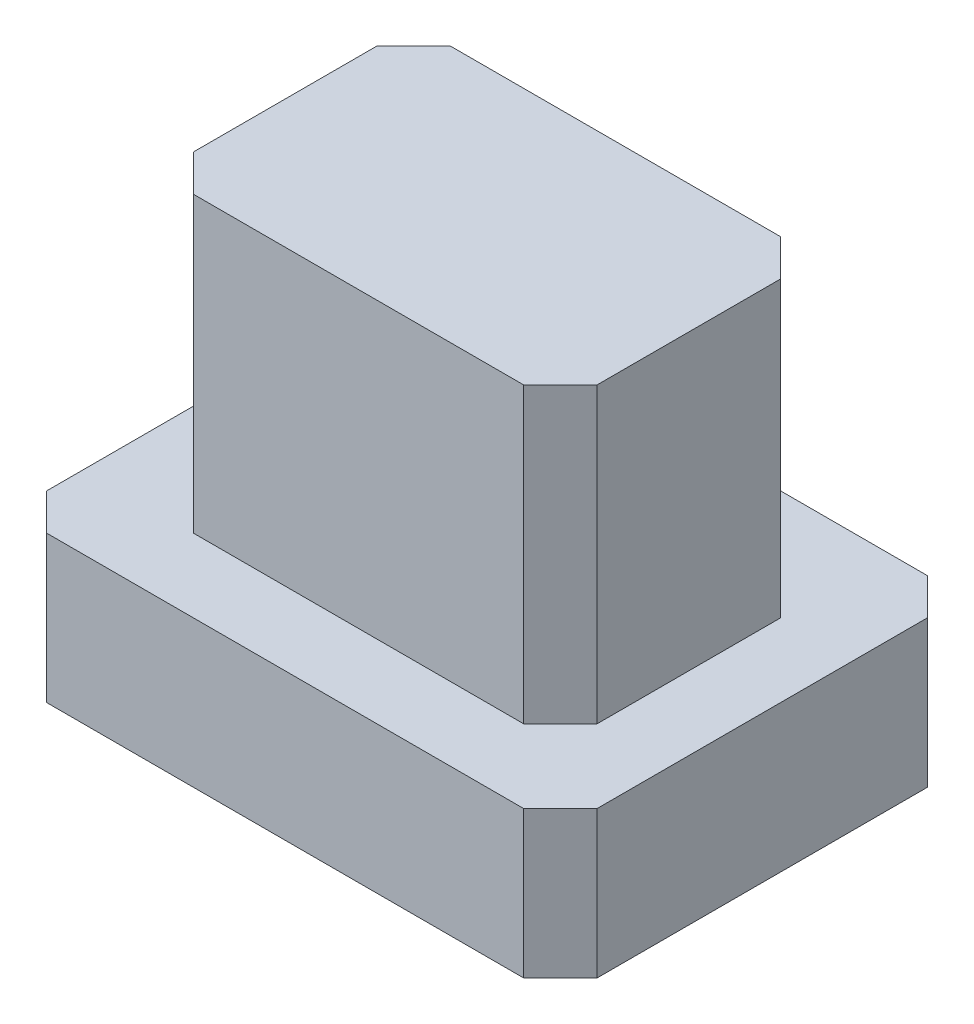
ISO-10303-21;
HEADER;
FILE_DESCRIPTION(('STEP AP214'),'2;1');
FILE_NAME('part.step','',(''),(''),'','','');
FILE_SCHEMA(('AUTOMOTIVE_DESIGN { 1 0 10303 214 1 1 1 1 }'));
ENDSEC;
DATA;
#1=APPLICATION_CONTEXT('core data for automotive mechanical design processes');
#2=APPLICATION_PROTOCOL_DEFINITION('international standard','automotive_design',2000,#1);
#3=PRODUCT_CONTEXT('',#1,'mechanical');
#4=PRODUCT('Part','Part','',(#3));
#5=PRODUCT_RELATED_PRODUCT_CATEGORY('part','',(#4));
#6=PRODUCT_DEFINITION_FORMATION('','',#4);
#7=PRODUCT_DEFINITION_CONTEXT('part definition',#1,'design');
#8=PRODUCT_DEFINITION('design','',#6,#7);
#9=PRODUCT_DEFINITION_SHAPE('','',#8);
#10=(LENGTH_UNIT() NAMED_UNIT(*) SI_UNIT(.MILLI.,.METRE.));
#11=(NAMED_UNIT(*) PLANE_ANGLE_UNIT() SI_UNIT($,.RADIAN.));
#12=(NAMED_UNIT(*) SI_UNIT($,.STERADIAN.) SOLID_ANGLE_UNIT());
#13=UNCERTAINTY_MEASURE_WITH_UNIT(LENGTH_MEASURE(1.E-05),#10,'distance_accuracy_value','');
#14=(GEOMETRIC_REPRESENTATION_CONTEXT(3) GLOBAL_UNCERTAINTY_ASSIGNED_CONTEXT((#13)) GLOBAL_UNIT_ASSIGNED_CONTEXT((#10,
#11,#12)) REPRESENTATION_CONTEXT('',''));
#15=CARTESIAN_POINT('',(0.,0.,0.));
#16=DIRECTION('',(0.,0.,1.));
#17=DIRECTION('',(1.,0.,0.));
#18=AXIS2_PLACEMENT_3D('',#15,#16,#17);
#19=CARTESIAN_POINT('',(0.,0.,0.));
#20=DIRECTION('',(0.,-1.,0.));
#21=DIRECTION('',(0.,0.,-1.));
#22=AXIS2_PLACEMENT_3D('',#19,#20,#21);
#23=PLANE('',#22);
#24=DIRECTION('',(-1.,0.,0.));
#25=VECTOR('',#24,1.);
#26=CARTESIAN_POINT('',(-7.5,0.,-5.49999999999999));
#27=LINE('',#26,#25);
#28=CARTESIAN_POINT('',(6.5,0.,-5.49999999999999));
#29=VERTEX_POINT('',#28);
#30=CARTESIAN_POINT('',(-6.5,0.,-5.49999999999999));
#31=VERTEX_POINT('',#30);
#32=EDGE_CURVE('E147',#29,#31,#27,.T.);
#33=ORIENTED_EDGE('',*,*,#32,.T.);
#34=DIRECTION('',(0.707106781186546,0.,-0.707106781186549));
#35=VECTOR('',#34,1.);
#36=CARTESIAN_POINT('',(-6.5,0.,-5.49999999999999));
#37=LINE('',#36,#35);
#38=CARTESIAN_POINT('',(-7.5,0.,-4.49999999999999));
#39=VERTEX_POINT('',#38);
#40=EDGE_CURVE('E182',#31,#39,#37,.F.);
#41=ORIENTED_EDGE('',*,*,#40,.T.);
#42=DIRECTION('',(0.,0.,1.));
#43=VECTOR('',#42,1.);
#44=CARTESIAN_POINT('',(-7.5,0.,5.5));
#45=LINE('',#44,#43);
#46=CARTESIAN_POINT('',(-7.5,0.,4.5));
#47=VERTEX_POINT('',#46);
#48=EDGE_CURVE('E165',#39,#47,#45,.T.);
#49=ORIENTED_EDGE('',*,*,#48,.T.);
#50=DIRECTION('',(-0.707106781186549,0.,-0.707106781186546));
#51=VECTOR('',#50,1.);
#52=CARTESIAN_POINT('',(-7.5,0.,4.5));
#53=LINE('',#52,#51);
#54=CARTESIAN_POINT('',(-6.5,0.,5.5));
#55=VERTEX_POINT('',#54);
#56=EDGE_CURVE('E154',#47,#55,#53,.F.);
#57=ORIENTED_EDGE('',*,*,#56,.T.);
#58=DIRECTION('',(1.,0.,0.));
#59=VECTOR('',#58,1.);
#60=CARTESIAN_POINT('',(-7.5,0.,5.5));
#61=LINE('',#60,#59);
#62=CARTESIAN_POINT('',(6.5,0.,5.5));
#63=VERTEX_POINT('',#62);
#64=EDGE_CURVE('E177',#55,#63,#61,.T.);
#65=ORIENTED_EDGE('',*,*,#64,.T.);
#66=DIRECTION('',(-0.707106781186546,0.,0.707106781186549));
#67=VECTOR('',#66,1.);
#68=CARTESIAN_POINT('',(6.5,0.,5.5));
#69=LINE('',#68,#67);
#70=CARTESIAN_POINT('',(7.5,0.,4.5));
#71=VERTEX_POINT('',#70);
#72=EDGE_CURVE('E155',#63,#71,#69,.F.);
#73=ORIENTED_EDGE('',*,*,#72,.T.);
#74=DIRECTION('',(0.,0.,-1.));
#75=VECTOR('',#74,1.);
#76=CARTESIAN_POINT('',(7.5,0.,5.5));
#77=LINE('',#76,#75);
#78=CARTESIAN_POINT('',(7.5,0.,-4.49999999999999));
#79=VERTEX_POINT('',#78);
#80=EDGE_CURVE('E149',#71,#79,#77,.T.);
#81=ORIENTED_EDGE('',*,*,#80,.T.);
#82=DIRECTION('',(0.707106781186549,0.,0.707106781186546));
#83=VECTOR('',#82,1.);
#84=CARTESIAN_POINT('',(7.5,0.,-4.5));
#85=LINE('',#84,#83);
#86=EDGE_CURVE('E145',#79,#29,#85,.F.);
#87=ORIENTED_EDGE('',*,*,#86,.T.);
#88=EDGE_LOOP('',(#33,#41,#49,#57,#65,#73,#81,#87));
#89=FACE_BOUND('',#88,.T.);
#90=DIRECTION('',(0.,0.,-1.));
#91=VECTOR('',#90,1.);
#92=CARTESIAN_POINT('',(5.5,0.,3.49999999999999));
#93=LINE('',#92,#91);
#94=CARTESIAN_POINT('',(5.5,0.,2.49999999999999));
#95=VERTEX_POINT('',#94);
#96=CARTESIAN_POINT('',(5.5,0.,-2.49999999999999));
#97=VERTEX_POINT('',#96);
#98=EDGE_CURVE('E238',#95,#97,#93,.T.);
#99=ORIENTED_EDGE('',*,*,#98,.F.);
#100=DIRECTION('',(0.707106781186549,0.,-0.707106781186546));
#101=VECTOR('',#100,1.);
#102=CARTESIAN_POINT('',(3.99999999999999,0.,4.));
#103=LINE('',#102,#101);
#104=CARTESIAN_POINT('',(4.5,0.,3.49999999999999));
#105=VERTEX_POINT('',#104);
#106=EDGE_CURVE('E232',#95,#105,#103,.F.);
#107=ORIENTED_EDGE('',*,*,#106,.T.);
#108=DIRECTION('',(1.,0.,0.));
#109=VECTOR('',#108,1.);
#110=CARTESIAN_POINT('',(-5.5,0.,3.49999999999999));
#111=LINE('',#110,#109);
#112=CARTESIAN_POINT('',(-4.5,0.,3.49999999999999));
#113=VERTEX_POINT('',#112);
#114=EDGE_CURVE('E267',#113,#105,#111,.T.);
#115=ORIENTED_EDGE('',*,*,#114,.F.);
#116=DIRECTION('',(0.707106781186546,0.,0.707106781186549));
#117=VECTOR('',#116,1.);
#118=CARTESIAN_POINT('',(-4.,0.,3.99999999999999));
#119=LINE('',#118,#117);
#120=CARTESIAN_POINT('',(-5.5,0.,2.49999999999999));
#121=VERTEX_POINT('',#120);
#122=EDGE_CURVE('E41',#113,#121,#119,.F.);
#123=ORIENTED_EDGE('',*,*,#122,.T.);
#124=DIRECTION('',(0.,0.,1.));
#125=VECTOR('',#124,1.);
#126=CARTESIAN_POINT('',(-5.5,0.,3.49999999999999));
#127=LINE('',#126,#125);
#128=CARTESIAN_POINT('',(-5.5,0.,-2.49999999999999));
#129=VERTEX_POINT('',#128);
#130=EDGE_CURVE('E272',#129,#121,#127,.T.);
#131=ORIENTED_EDGE('',*,*,#130,.F.);
#132=DIRECTION('',(-0.707106781186549,0.,0.707106781186546));
#133=VECTOR('',#132,1.);
#134=CARTESIAN_POINT('',(-3.99999999999998,0.,-4.));
#135=LINE('',#134,#133);
#136=CARTESIAN_POINT('',(-4.49999999999999,0.,-3.49999999999999));
#137=VERTEX_POINT('',#136);
#138=EDGE_CURVE('E11',#129,#137,#135,.F.);
#139=ORIENTED_EDGE('',*,*,#138,.T.);
#140=DIRECTION('',(-1.,0.,0.));
#141=VECTOR('',#140,1.);
#142=CARTESIAN_POINT('',(-5.5,0.,-3.49999999999999));
#143=LINE('',#142,#141);
#144=CARTESIAN_POINT('',(4.5,0.,-3.49999999999999));
#145=VERTEX_POINT('',#144);
#146=EDGE_CURVE('E240',#145,#137,#143,.T.);
#147=ORIENTED_EDGE('',*,*,#146,.F.);
#148=DIRECTION('',(-0.707106781186546,0.,-0.707106781186549));
#149=VECTOR('',#148,1.);
#150=CARTESIAN_POINT('',(4.,0.,-3.99999999999999));
#151=LINE('',#150,#149);
#152=EDGE_CURVE('E234',#145,#97,#151,.F.);
#153=ORIENTED_EDGE('',*,*,#152,.T.);
#154=EDGE_LOOP('',(#99,#107,#115,#123,#131,#139,#147,#153));
#155=FACE_BOUND('',#154,.T.);
#156=ADVANCED_FACE('F33',(#89,#155),#23,.F.);
#157=CARTESIAN_POINT('',(7.5,-4.,5.5));
#158=DIRECTION('',(1.,0.,0.));
#159=DIRECTION('',(0.,0.,-1.));
#160=AXIS2_PLACEMENT_3D('',#157,#158,#159);
#161=PLANE('',#160);
#162=DIRECTION('',(0.,0.,-1.));
#163=VECTOR('',#162,1.);
#164=CARTESIAN_POINT('',(7.5,-4.,5.5));
#165=LINE('',#164,#163);
#166=CARTESIAN_POINT('',(7.5,-4.,4.5));
#167=VERTEX_POINT('',#166);
#168=CARTESIAN_POINT('',(7.5,-4.,-4.49999999999999));
#169=VERTEX_POINT('',#168);
#170=EDGE_CURVE('E276',#167,#169,#165,.T.);
#171=ORIENTED_EDGE('',*,*,#170,.T.);
#172=DIRECTION('',(0.,1.,0.));
#173=VECTOR('',#172,1.);
#174=CARTESIAN_POINT('',(7.5,-4.,-4.5));
#175=LINE('',#174,#173);
#176=EDGE_CURVE('E203',#169,#79,#175,.T.);
#177=ORIENTED_EDGE('',*,*,#176,.T.);
#178=ORIENTED_EDGE('',*,*,#80,.F.);
#179=DIRECTION('',(0.,-1.,0.));
#180=VECTOR('',#179,1.);
#181=CARTESIAN_POINT('',(7.5,-4.,4.5));
#182=LINE('',#181,#180);
#183=EDGE_CURVE('E201',#71,#167,#182,.T.);
#184=ORIENTED_EDGE('',*,*,#183,.T.);
#185=EDGE_LOOP('',(#171,#177,#178,#184));
#186=FACE_BOUND('',#185,.T.);
#187=ADVANCED_FACE('F308',(#186),#161,.T.);
#188=CARTESIAN_POINT('',(-7.5,-4.,5.5));
#189=DIRECTION('',(0.,0.,1.));
#190=DIRECTION('',(1.,0.,0.));
#191=AXIS2_PLACEMENT_3D('',#188,#189,#190);
#192=PLANE('',#191);
#193=ORIENTED_EDGE('',*,*,#64,.F.);
#194=DIRECTION('',(0.,-1.,0.));
#195=VECTOR('',#194,1.);
#196=CARTESIAN_POINT('',(-6.5,-4.,5.5));
#197=LINE('',#196,#195);
#198=CARTESIAN_POINT('',(-6.5,-4.,5.5));
#199=VERTEX_POINT('',#198);
#200=EDGE_CURVE('E199',#55,#199,#197,.T.);
#201=ORIENTED_EDGE('',*,*,#200,.T.);
#202=DIRECTION('',(1.,0.,0.));
#203=VECTOR('',#202,1.);
#204=CARTESIAN_POINT('',(-7.5,-4.,5.5));
#205=LINE('',#204,#203);
#206=CARTESIAN_POINT('',(6.5,-4.,5.5));
#207=VERTEX_POINT('',#206);
#208=EDGE_CURVE('E170',#199,#207,#205,.T.);
#209=ORIENTED_EDGE('',*,*,#208,.T.);
#210=DIRECTION('',(0.,1.,0.));
#211=VECTOR('',#210,1.);
#212=CARTESIAN_POINT('',(6.5,-4.,5.5));
#213=LINE('',#212,#211);
#214=EDGE_CURVE('E196',#207,#63,#213,.T.);
#215=ORIENTED_EDGE('',*,*,#214,.T.);
#216=EDGE_LOOP('',(#193,#201,#209,#215));
#217=FACE_BOUND('',#216,.T.);
#218=ADVANCED_FACE('F289',(#217),#192,.T.);
#219=CARTESIAN_POINT('',(-7.5,-4.,5.5));
#220=DIRECTION('',(-1.,0.,0.));
#221=DIRECTION('',(0.,0.,1.));
#222=AXIS2_PLACEMENT_3D('',#219,#220,#221);
#223=PLANE('',#222);
#224=ORIENTED_EDGE('',*,*,#48,.F.);
#225=DIRECTION('',(0.,-1.,0.));
#226=VECTOR('',#225,1.);
#227=CARTESIAN_POINT('',(-7.5,-4.,-4.49999999999999));
#228=LINE('',#227,#226);
#229=CARTESIAN_POINT('',(-7.5,-4.,-4.49999999999999));
#230=VERTEX_POINT('',#229);
#231=EDGE_CURVE('E187',#39,#230,#228,.T.);
#232=ORIENTED_EDGE('',*,*,#231,.T.);
#233=DIRECTION('',(0.,0.,1.));
#234=VECTOR('',#233,1.);
#235=CARTESIAN_POINT('',(-7.5,-4.,5.5));
#236=LINE('',#235,#234);
#237=CARTESIAN_POINT('',(-7.5,-4.,4.5));
#238=VERTEX_POINT('',#237);
#239=EDGE_CURVE('E174',#230,#238,#236,.T.);
#240=ORIENTED_EDGE('',*,*,#239,.T.);
#241=DIRECTION('',(0.,1.,0.));
#242=VECTOR('',#241,1.);
#243=CARTESIAN_POINT('',(-7.5,-4.,4.5));
#244=LINE('',#243,#242);
#245=EDGE_CURVE('E184',#238,#47,#244,.T.);
#246=ORIENTED_EDGE('',*,*,#245,.T.);
#247=EDGE_LOOP('',(#224,#232,#240,#246));
#248=FACE_BOUND('',#247,.T.);
#249=ADVANCED_FACE('F301',(#248),#223,.T.);
#250=CARTESIAN_POINT('',(-7.5,-4.,-5.49999999999999));
#251=DIRECTION('',(0.,0.,-1.));
#252=DIRECTION('',(-1.,0.,0.));
#253=AXIS2_PLACEMENT_3D('',#250,#251,#252);
#254=PLANE('',#253);
#255=DIRECTION('',(-1.,0.,0.));
#256=VECTOR('',#255,1.);
#257=CARTESIAN_POINT('',(-7.5,-4.,-5.49999999999999));
#258=LINE('',#257,#256);
#259=CARTESIAN_POINT('',(6.5,-4.,-5.49999999999999));
#260=VERTEX_POINT('',#259);
#261=CARTESIAN_POINT('',(-6.5,-4.,-5.49999999999999));
#262=VERTEX_POINT('',#261);
#263=EDGE_CURVE('E279',#260,#262,#258,.T.);
#264=ORIENTED_EDGE('',*,*,#263,.T.);
#265=DIRECTION('',(0.,1.,0.));
#266=VECTOR('',#265,1.);
#267=CARTESIAN_POINT('',(-6.5,-4.,-5.49999999999999));
#268=LINE('',#267,#266);
#269=EDGE_CURVE('E164',#262,#31,#268,.T.);
#270=ORIENTED_EDGE('',*,*,#269,.T.);
#271=ORIENTED_EDGE('',*,*,#32,.F.);
#272=DIRECTION('',(0.,-1.,0.));
#273=VECTOR('',#272,1.);
#274=CARTESIAN_POINT('',(6.5,-4.,-5.49999999999999));
#275=LINE('',#274,#273);
#276=EDGE_CURVE('E161',#29,#260,#275,.T.);
#277=ORIENTED_EDGE('',*,*,#276,.T.);
#278=EDGE_LOOP('',(#264,#270,#271,#277));
#279=FACE_BOUND('',#278,.T.);
#280=ADVANCED_FACE('F160',(#279),#254,.T.);
#281=CARTESIAN_POINT('',(0.,-4.,0.));
#282=DIRECTION('',(0.,-1.,0.));
#283=DIRECTION('',(0.,0.,-1.));
#284=AXIS2_PLACEMENT_3D('',#281,#282,#283);
#285=PLANE('',#284);
#286=ORIENTED_EDGE('',*,*,#239,.F.);
#287=DIRECTION('',(-0.707106781186546,0.,0.707106781186549));
#288=VECTOR('',#287,1.);
#289=CARTESIAN_POINT('',(-6.00000000000001,-4.,-5.99999999999999));
#290=LINE('',#289,#288);
#291=EDGE_CURVE('E194',#230,#262,#290,.F.);
#292=ORIENTED_EDGE('',*,*,#291,.T.);
#293=ORIENTED_EDGE('',*,*,#263,.F.);
#294=DIRECTION('',(-0.707106781186549,0.,-0.707106781186546));
#295=VECTOR('',#294,1.);
#296=CARTESIAN_POINT('',(5.99999999999998,-4.,-6.00000000000001));
#297=LINE('',#296,#295);
#298=EDGE_CURVE('E169',#260,#169,#297,.F.);
#299=ORIENTED_EDGE('',*,*,#298,.T.);
#300=ORIENTED_EDGE('',*,*,#170,.F.);
#301=DIRECTION('',(0.707106781186546,0.,-0.707106781186549));
#302=VECTOR('',#301,1.);
#303=CARTESIAN_POINT('',(6.00000000000001,-4.,5.99999999999999));
#304=LINE('',#303,#302);
#305=EDGE_CURVE('E189',#167,#207,#304,.F.);
#306=ORIENTED_EDGE('',*,*,#305,.T.);
#307=ORIENTED_EDGE('',*,*,#208,.F.);
#308=DIRECTION('',(0.707106781186549,0.,0.707106781186546));
#309=VECTOR('',#308,1.);
#310=CARTESIAN_POINT('',(-5.99999999999999,-4.,6.00000000000001));
#311=LINE('',#310,#309);
#312=EDGE_CURVE('E192',#199,#238,#311,.F.);
#313=ORIENTED_EDGE('',*,*,#312,.T.);
#314=EDGE_LOOP('',(#286,#292,#293,#299,#300,#306,#307,#313));
#315=FACE_BOUND('',#314,.T.);
#316=ADVANCED_FACE('F298',(#315),#285,.T.);
#317=CARTESIAN_POINT('',(-6.5,-4.,-5.49999999999999));
#318=DIRECTION('',(0.707106781186549,0.,0.707106781186546));
#319=DIRECTION('',(0.,1.,0.));
#320=AXIS2_PLACEMENT_3D('',#317,#318,#319);
#321=PLANE('',#320);
#322=ORIENTED_EDGE('',*,*,#291,.F.);
#323=ORIENTED_EDGE('',*,*,#231,.F.);
#324=ORIENTED_EDGE('',*,*,#40,.F.);
#325=ORIENTED_EDGE('',*,*,#269,.F.);
#326=EDGE_LOOP('',(#322,#323,#324,#325));
#327=FACE_BOUND('',#326,.T.);
#328=ADVANCED_FACE('F304',(#327),#321,.F.);
#329=CARTESIAN_POINT('',(-7.5,-4.,4.5));
#330=DIRECTION('',(0.707106781186546,0.,-0.707106781186549));
#331=DIRECTION('',(0.,1.,0.));
#332=AXIS2_PLACEMENT_3D('',#329,#330,#331);
#333=PLANE('',#332);
#334=ORIENTED_EDGE('',*,*,#312,.F.);
#335=ORIENTED_EDGE('',*,*,#200,.F.);
#336=ORIENTED_EDGE('',*,*,#56,.F.);
#337=ORIENTED_EDGE('',*,*,#245,.F.);
#338=EDGE_LOOP('',(#334,#335,#336,#337));
#339=FACE_BOUND('',#338,.T.);
#340=ADVANCED_FACE('F294',(#339),#333,.F.);
#341=CARTESIAN_POINT('',(7.5,-4.,-4.5));
#342=DIRECTION('',(-0.707106781186546,0.,0.707106781186549));
#343=DIRECTION('',(0.,1.,0.));
#344=AXIS2_PLACEMENT_3D('',#341,#342,#343);
#345=PLANE('',#344);
#346=ORIENTED_EDGE('',*,*,#298,.F.);
#347=ORIENTED_EDGE('',*,*,#276,.F.);
#348=ORIENTED_EDGE('',*,*,#86,.F.);
#349=ORIENTED_EDGE('',*,*,#176,.F.);
#350=EDGE_LOOP('',(#346,#347,#348,#349));
#351=FACE_BOUND('',#350,.T.);
#352=ADVANCED_FACE('F168',(#351),#345,.F.);
#353=CARTESIAN_POINT('',(6.5,-4.,5.5));
#354=DIRECTION('',(-0.707106781186549,0.,-0.707106781186546));
#355=DIRECTION('',(0.,1.,0.));
#356=AXIS2_PLACEMENT_3D('',#353,#354,#355);
#357=PLANE('',#356);
#358=ORIENTED_EDGE('',*,*,#305,.F.);
#359=ORIENTED_EDGE('',*,*,#183,.F.);
#360=ORIENTED_EDGE('',*,*,#72,.F.);
#361=ORIENTED_EDGE('',*,*,#214,.F.);
#362=EDGE_LOOP('',(#358,#359,#360,#361));
#363=FACE_BOUND('',#362,.T.);
#364=ADVANCED_FACE('F311',(#363),#357,.F.);
#365=CARTESIAN_POINT('',(5.5,8.,3.49999999999999));
#366=DIRECTION('',(-1.,0.,0.));
#367=DIRECTION('',(0.,0.,1.));
#368=AXIS2_PLACEMENT_3D('',#365,#366,#367);
#369=PLANE('',#368);
#370=DIRECTION('',(0.,0.,-1.));
#371=VECTOR('',#370,1.);
#372=CARTESIAN_POINT('',(5.5,8.,3.49999999999999));
#373=LINE('',#372,#371);
#374=CARTESIAN_POINT('',(5.5,8.,2.49999999999999));
#375=VERTEX_POINT('',#374);
#376=CARTESIAN_POINT('',(5.5,8.,-2.49999999999999));
#377=VERTEX_POINT('',#376);
#378=EDGE_CURVE('E259',#375,#377,#373,.T.);
#379=ORIENTED_EDGE('',*,*,#378,.F.);
#380=DIRECTION('',(0.,-1.,0.));
#381=VECTOR('',#380,1.);
#382=CARTESIAN_POINT('',(5.5,8.,2.49999999999999));
#383=LINE('',#382,#381);
#384=EDGE_CURVE('E207',#375,#95,#383,.T.);
#385=ORIENTED_EDGE('',*,*,#384,.T.);
#386=ORIENTED_EDGE('',*,*,#98,.T.);
#387=DIRECTION('',(0.,1.,0.));
#388=VECTOR('',#387,1.);
#389=CARTESIAN_POINT('',(5.5,8.,-2.49999999999999));
#390=LINE('',#389,#388);
#391=EDGE_CURVE('E205',#97,#377,#390,.T.);
#392=ORIENTED_EDGE('',*,*,#391,.T.);
#393=EDGE_LOOP('',(#379,#385,#386,#392));
#394=FACE_BOUND('',#393,.T.);
#395=ADVANCED_FACE('F246',(#394),#369,.F.);
#396=CARTESIAN_POINT('',(-5.5,8.,-3.49999999999999));
#397=DIRECTION('',(0.,0.,1.));
#398=DIRECTION('',(1.,0.,0.));
#399=AXIS2_PLACEMENT_3D('',#396,#397,#398);
#400=PLANE('',#399);
#401=DIRECTION('',(-1.,0.,0.));
#402=VECTOR('',#401,1.);
#403=CARTESIAN_POINT('',(-5.5,8.,-3.49999999999999));
#404=LINE('',#403,#402);
#405=CARTESIAN_POINT('',(4.5,8.,-3.49999999999999));
#406=VERTEX_POINT('',#405);
#407=CARTESIAN_POINT('',(-4.49999999999999,8.,-3.49999999999999));
#408=VERTEX_POINT('',#407);
#409=EDGE_CURVE('E257',#406,#408,#404,.T.);
#410=ORIENTED_EDGE('',*,*,#409,.F.);
#411=DIRECTION('',(0.,-1.,0.));
#412=VECTOR('',#411,1.);
#413=CARTESIAN_POINT('',(4.5,8.,-3.49999999999999));
#414=LINE('',#413,#412);
#415=EDGE_CURVE('E225',#406,#145,#414,.T.);
#416=ORIENTED_EDGE('',*,*,#415,.T.);
#417=ORIENTED_EDGE('',*,*,#146,.T.);
#418=DIRECTION('',(0.,1.,0.));
#419=VECTOR('',#418,1.);
#420=CARTESIAN_POINT('',(-4.49999999999999,8.,-3.49999999999999));
#421=LINE('',#420,#419);
#422=EDGE_CURVE('E223',#137,#408,#421,.T.);
#423=ORIENTED_EDGE('',*,*,#422,.T.);
#424=EDGE_LOOP('',(#410,#416,#417,#423));
#425=FACE_BOUND('',#424,.T.);
#426=ADVANCED_FACE('F261',(#425),#400,.F.);
#427=CARTESIAN_POINT('',(-5.5,8.,3.49999999999999));
#428=DIRECTION('',(1.,0.,0.));
#429=DIRECTION('',(0.,0.,-1.));
#430=AXIS2_PLACEMENT_3D('',#427,#428,#429);
#431=PLANE('',#430);
#432=ORIENTED_EDGE('',*,*,#130,.T.);
#433=DIRECTION('',(0.,1.,0.));
#434=VECTOR('',#433,1.);
#435=CARTESIAN_POINT('',(-5.5,8.,2.49999999999999));
#436=LINE('',#435,#434);
#437=CARTESIAN_POINT('',(-5.5,8.,2.49999999999999));
#438=VERTEX_POINT('',#437);
#439=EDGE_CURVE('E230',#121,#438,#436,.T.);
#440=ORIENTED_EDGE('',*,*,#439,.T.);
#441=DIRECTION('',(0.,0.,1.));
#442=VECTOR('',#441,1.);
#443=CARTESIAN_POINT('',(-5.5,8.,3.49999999999999));
#444=LINE('',#443,#442);
#445=CARTESIAN_POINT('',(-5.5,8.,-2.49999999999999));
#446=VERTEX_POINT('',#445);
#447=EDGE_CURVE('E262',#446,#438,#444,.T.);
#448=ORIENTED_EDGE('',*,*,#447,.F.);
#449=DIRECTION('',(0.,-1.,0.));
#450=VECTOR('',#449,1.);
#451=CARTESIAN_POINT('',(-5.5,8.,-2.49999999999999));
#452=LINE('',#451,#450);
#453=EDGE_CURVE('E228',#446,#129,#452,.T.);
#454=ORIENTED_EDGE('',*,*,#453,.T.);
#455=EDGE_LOOP('',(#432,#440,#448,#454));
#456=FACE_BOUND('',#455,.T.);
#457=ADVANCED_FACE('F370',(#456),#431,.F.);
#458=CARTESIAN_POINT('',(-5.5,8.,3.49999999999999));
#459=DIRECTION('',(0.,0.,-1.));
#460=DIRECTION('',(-1.,0.,0.));
#461=AXIS2_PLACEMENT_3D('',#458,#459,#460);
#462=PLANE('',#461);
#463=ORIENTED_EDGE('',*,*,#114,.T.);
#464=DIRECTION('',(0.,1.,0.));
#465=VECTOR('',#464,1.);
#466=CARTESIAN_POINT('',(4.5,8.,3.49999999999999));
#467=LINE('',#466,#465);
#468=CARTESIAN_POINT('',(4.49999999999999,8.,3.5));
#469=VERTEX_POINT('',#468);
#470=EDGE_CURVE('E213',#105,#469,#467,.T.);
#471=ORIENTED_EDGE('',*,*,#470,.T.);
#472=DIRECTION('',(1.,0.,0.));
#473=VECTOR('',#472,1.);
#474=CARTESIAN_POINT('',(-5.5,8.,3.49999999999999));
#475=LINE('',#474,#473);
#476=CARTESIAN_POINT('',(-4.5,8.,3.49999999999999));
#477=VERTEX_POINT('',#476);
#478=EDGE_CURVE('E265',#477,#469,#475,.T.);
#479=ORIENTED_EDGE('',*,*,#478,.F.);
#480=DIRECTION('',(0.,-1.,0.));
#481=VECTOR('',#480,1.);
#482=CARTESIAN_POINT('',(-4.5,8.,3.49999999999999));
#483=LINE('',#482,#481);
#484=EDGE_CURVE('E210',#477,#113,#483,.T.);
#485=ORIENTED_EDGE('',*,*,#484,.T.);
#486=EDGE_LOOP('',(#463,#471,#479,#485));
#487=FACE_BOUND('',#486,.T.);
#488=ADVANCED_FACE('F379',(#487),#462,.F.);
#489=CARTESIAN_POINT('',(0.,8.,0.));
#490=DIRECTION('',(0.,-1.,0.));
#491=DIRECTION('',(0.,0.,-1.));
#492=AXIS2_PLACEMENT_3D('',#489,#490,#491);
#493=PLANE('',#492);
#494=ORIENTED_EDGE('',*,*,#478,.T.);
#495=DIRECTION('',(-0.707106781186549,0.,0.707106781186546));
#496=VECTOR('',#495,1.);
#497=CARTESIAN_POINT('',(5.5,8.,2.49999999999999));
#498=LINE('',#497,#496);
#499=EDGE_CURVE('E221',#469,#375,#498,.F.);
#500=ORIENTED_EDGE('',*,*,#499,.T.);
#501=ORIENTED_EDGE('',*,*,#378,.T.);
#502=DIRECTION('',(0.707106781186546,0.,0.707106781186549));
#503=VECTOR('',#502,1.);
#504=CARTESIAN_POINT('',(4.5,8.,-3.49999999999999));
#505=LINE('',#504,#503);
#506=EDGE_CURVE('E219',#377,#406,#505,.F.);
#507=ORIENTED_EDGE('',*,*,#506,.T.);
#508=ORIENTED_EDGE('',*,*,#409,.T.);
#509=DIRECTION('',(0.707106781186549,0.,-0.707106781186546));
#510=VECTOR('',#509,1.);
#511=CARTESIAN_POINT('',(-5.5,8.,-2.49999999999999));
#512=LINE('',#511,#510);
#513=EDGE_CURVE('E215',#408,#446,#512,.F.);
#514=ORIENTED_EDGE('',*,*,#513,.T.);
#515=ORIENTED_EDGE('',*,*,#447,.T.);
#516=DIRECTION('',(-0.707106781186546,0.,-0.707106781186549));
#517=VECTOR('',#516,1.);
#518=CARTESIAN_POINT('',(-4.5,8.,3.49999999999999));
#519=LINE('',#518,#517);
#520=EDGE_CURVE('E217',#438,#477,#519,.F.);
#521=ORIENTED_EDGE('',*,*,#520,.T.);
#522=EDGE_LOOP('',(#494,#500,#501,#507,#508,#514,#515,#521));
#523=FACE_BOUND('',#522,.T.);
#524=ADVANCED_FACE('F256',(#523),#493,.F.);
#525=CARTESIAN_POINT('',(5.5,8.,2.49999999999999));
#526=DIRECTION('',(-0.707106781186546,0.,-0.707106781186549));
#527=DIRECTION('',(0.,-1.,0.));
#528=AXIS2_PLACEMENT_3D('',#525,#526,#527);
#529=PLANE('',#528);
#530=ORIENTED_EDGE('',*,*,#499,.F.);
#531=ORIENTED_EDGE('',*,*,#470,.F.);
#532=ORIENTED_EDGE('',*,*,#106,.F.);
#533=ORIENTED_EDGE('',*,*,#384,.F.);
#534=EDGE_LOOP('',(#530,#531,#532,#533));
#535=FACE_BOUND('',#534,.T.);
#536=ADVANCED_FACE('F398',(#535),#529,.F.);
#537=CARTESIAN_POINT('',(4.5,8.,-3.49999999999999));
#538=DIRECTION('',(-0.707106781186549,0.,0.707106781186546));
#539=DIRECTION('',(0.,-1.,0.));
#540=AXIS2_PLACEMENT_3D('',#537,#538,#539);
#541=PLANE('',#540);
#542=ORIENTED_EDGE('',*,*,#506,.F.);
#543=ORIENTED_EDGE('',*,*,#391,.F.);
#544=ORIENTED_EDGE('',*,*,#152,.F.);
#545=ORIENTED_EDGE('',*,*,#415,.F.);
#546=EDGE_LOOP('',(#542,#543,#544,#545));
#547=FACE_BOUND('',#546,.T.);
#548=ADVANCED_FACE('F251',(#547),#541,.F.);
#549=CARTESIAN_POINT('',(-4.5,8.,3.49999999999999));
#550=DIRECTION('',(0.707106781186549,0.,-0.707106781186546));
#551=DIRECTION('',(0.,-1.,0.));
#552=AXIS2_PLACEMENT_3D('',#549,#550,#551);
#553=PLANE('',#552);
#554=ORIENTED_EDGE('',*,*,#520,.F.);
#555=ORIENTED_EDGE('',*,*,#439,.F.);
#556=ORIENTED_EDGE('',*,*,#122,.F.);
#557=ORIENTED_EDGE('',*,*,#484,.F.);
#558=EDGE_LOOP('',(#554,#555,#556,#557));
#559=FACE_BOUND('',#558,.T.);
#560=ADVANCED_FACE('F415',(#559),#553,.F.);
#561=CARTESIAN_POINT('',(-5.5,8.,-2.49999999999999));
#562=DIRECTION('',(0.707106781186546,0.,0.707106781186549));
#563=DIRECTION('',(0.,-1.,0.));
#564=AXIS2_PLACEMENT_3D('',#561,#562,#563);
#565=PLANE('',#564);
#566=ORIENTED_EDGE('',*,*,#513,.F.);
#567=ORIENTED_EDGE('',*,*,#422,.F.);
#568=ORIENTED_EDGE('',*,*,#138,.F.);
#569=ORIENTED_EDGE('',*,*,#453,.F.);
#570=EDGE_LOOP('',(#566,#567,#568,#569));
#571=FACE_BOUND('',#570,.T.);
#572=ADVANCED_FACE('F35',(#571),#565,.F.);
#573=CLOSED_SHELL('',(#156,#187,#218,#249,#280,#316,#328,#340,#352,#364,#395,#426,#457,#488,
#524,#536,#548,#560,#572));
#574=MANIFOLD_SOLID_BREP('B2',#573);
#575=ADVANCED_BREP_SHAPE_REPRESENTATION('',(#18,#574),#14);
#576=SHAPE_DEFINITION_REPRESENTATION(#9,#575);
ENDSEC;
END-ISO-10303-21;
